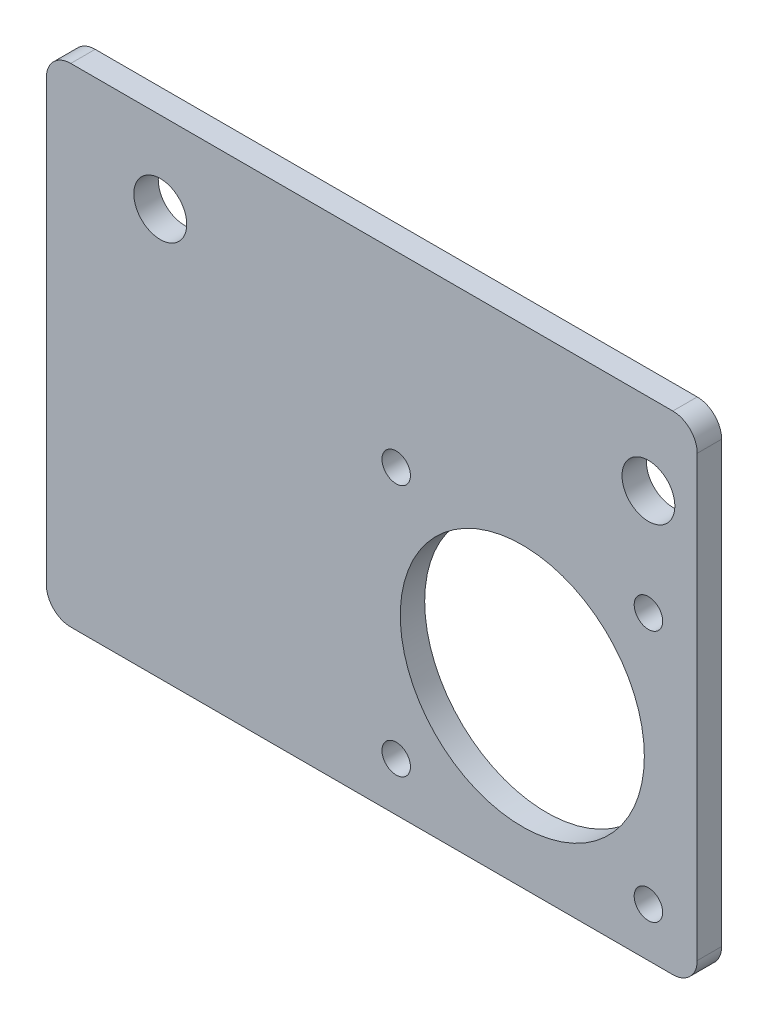
ISO-10303-21;
HEADER;
FILE_DESCRIPTION(('STEP AP214'),'2;1');
FILE_NAME('part.step','',(''),(''),'','','');
FILE_SCHEMA(('AUTOMOTIVE_DESIGN { 1 0 10303 214 1 1 1 1 }'));
ENDSEC;
DATA;
#1=APPLICATION_CONTEXT('core data for automotive mechanical design processes');
#2=APPLICATION_PROTOCOL_DEFINITION('international standard','automotive_design',2000,#1);
#3=PRODUCT_CONTEXT('',#1,'mechanical');
#4=PRODUCT('Part','Part','',(#3));
#5=PRODUCT_RELATED_PRODUCT_CATEGORY('part','',(#4));
#6=PRODUCT_DEFINITION_FORMATION('','',#4);
#7=PRODUCT_DEFINITION_CONTEXT('part definition',#1,'design');
#8=PRODUCT_DEFINITION('design','',#6,#7);
#9=PRODUCT_DEFINITION_SHAPE('','',#8);
#10=(LENGTH_UNIT() NAMED_UNIT(*) SI_UNIT(.MILLI.,.METRE.));
#11=(NAMED_UNIT(*) PLANE_ANGLE_UNIT() SI_UNIT($,.RADIAN.));
#12=(NAMED_UNIT(*) SI_UNIT($,.STERADIAN.) SOLID_ANGLE_UNIT());
#13=UNCERTAINTY_MEASURE_WITH_UNIT(LENGTH_MEASURE(1.E-05),#10,'distance_accuracy_value','');
#14=(GEOMETRIC_REPRESENTATION_CONTEXT(3) GLOBAL_UNCERTAINTY_ASSIGNED_CONTEXT((#13)) GLOBAL_UNIT_ASSIGNED_CONTEXT((#10,
#11,#12)) REPRESENTATION_CONTEXT('',''));
#15=CARTESIAN_POINT('',(0.,0.,0.));
#16=DIRECTION('',(0.,0.,1.));
#17=DIRECTION('',(1.,0.,0.));
#18=AXIS2_PLACEMENT_3D('',#15,#16,#17);
#19=CARTESIAN_POINT('',(-40.,30.,3.));
#20=DIRECTION('',(1.,0.,0.));
#21=DIRECTION('',(0.,1.,0.));
#22=AXIS2_PLACEMENT_3D('',#19,#20,#21);
#23=PLANE('',#22);
#24=DIRECTION('',(0.,-1.,0.));
#25=VECTOR('',#24,1.);
#26=CARTESIAN_POINT('',(-40.,30.,3.));
#27=LINE('',#26,#25);
#28=CARTESIAN_POINT('',(-40.,27.,3.));
#29=VERTEX_POINT('',#28);
#30=CARTESIAN_POINT('',(-40.,-27.,3.));
#31=VERTEX_POINT('',#30);
#32=EDGE_CURVE('E119',#29,#31,#27,.T.);
#33=ORIENTED_EDGE('',*,*,#32,.F.);
#34=DIRECTION('',(0.,0.,-1.));
#35=VECTOR('',#34,1.);
#36=CARTESIAN_POINT('',(-40.,27.,3.));
#37=LINE('',#36,#35);
#38=CARTESIAN_POINT('',(-40.,27.,0.));
#39=VERTEX_POINT('',#38);
#40=EDGE_CURVE('E104',#29,#39,#37,.T.);
#41=ORIENTED_EDGE('',*,*,#40,.T.);
#42=DIRECTION('',(0.,-1.,0.));
#43=VECTOR('',#42,1.);
#44=CARTESIAN_POINT('',(-40.,30.,0.));
#45=LINE('',#44,#43);
#46=CARTESIAN_POINT('',(-40.,-27.,0.));
#47=VERTEX_POINT('',#46);
#48=EDGE_CURVE('E116',#39,#47,#45,.T.);
#49=ORIENTED_EDGE('',*,*,#48,.T.);
#50=DIRECTION('',(0.,0.,-1.));
#51=VECTOR('',#50,1.);
#52=CARTESIAN_POINT('',(-40.,-27.,3.));
#53=LINE('',#52,#51);
#54=EDGE_CURVE('E121',#47,#31,#53,.F.);
#55=ORIENTED_EDGE('',*,*,#54,.T.);
#56=EDGE_LOOP('',(#33,#41,#49,#55));
#57=FACE_BOUND('',#56,.T.);
#58=ADVANCED_FACE('F32',(#57),#23,.F.);
#59=CARTESIAN_POINT('',(40.,-30.,3.));
#60=DIRECTION('',(0.,1.,0.));
#61=DIRECTION('',(-1.,0.,0.));
#62=AXIS2_PLACEMENT_3D('',#59,#60,#61);
#63=PLANE('',#62);
#64=DIRECTION('',(1.,0.,0.));
#65=VECTOR('',#64,1.);
#66=CARTESIAN_POINT('',(40.,-30.,0.));
#67=LINE('',#66,#65);
#68=CARTESIAN_POINT('',(-37.,-30.,0.));
#69=VERTEX_POINT('',#68);
#70=CARTESIAN_POINT('',(37.,-30.,0.));
#71=VERTEX_POINT('',#70);
#72=EDGE_CURVE('E125',#69,#71,#67,.T.);
#73=ORIENTED_EDGE('',*,*,#72,.T.);
#74=DIRECTION('',(0.,0.,-1.));
#75=VECTOR('',#74,1.);
#76=CARTESIAN_POINT('',(37.,-30.,3.));
#77=LINE('',#76,#75);
#78=CARTESIAN_POINT('',(37.,-30.,3.));
#79=VERTEX_POINT('',#78);
#80=EDGE_CURVE('E11',#71,#79,#77,.F.);
#81=ORIENTED_EDGE('',*,*,#80,.T.);
#82=DIRECTION('',(1.,0.,0.));
#83=VECTOR('',#82,1.);
#84=CARTESIAN_POINT('',(40.,-30.,3.));
#85=LINE('',#84,#83);
#86=CARTESIAN_POINT('',(-37.,-30.,3.));
#87=VERTEX_POINT('',#86);
#88=EDGE_CURVE('E201',#87,#79,#85,.T.);
#89=ORIENTED_EDGE('',*,*,#88,.F.);
#90=DIRECTION('',(0.,0.,-1.));
#91=VECTOR('',#90,1.);
#92=CARTESIAN_POINT('',(-37.,-30.,3.));
#93=LINE('',#92,#91);
#94=EDGE_CURVE('E41',#87,#69,#93,.T.);
#95=ORIENTED_EDGE('',*,*,#94,.T.);
#96=EDGE_LOOP('',(#73,#81,#89,#95));
#97=FACE_BOUND('',#96,.T.);
#98=ADVANCED_FACE('F219',(#97),#63,.F.);
#99=CARTESIAN_POINT('',(40.,30.,3.));
#100=DIRECTION('',(-1.,0.,0.));
#101=DIRECTION('',(0.,-1.,0.));
#102=AXIS2_PLACEMENT_3D('',#99,#100,#101);
#103=PLANE('',#102);
#104=DIRECTION('',(0.,1.,0.));
#105=VECTOR('',#104,1.);
#106=CARTESIAN_POINT('',(40.,30.,0.));
#107=LINE('',#106,#105);
#108=CARTESIAN_POINT('',(40.,-27.,0.));
#109=VERTEX_POINT('',#108);
#110=CARTESIAN_POINT('',(40.,27.,0.));
#111=VERTEX_POINT('',#110);
#112=EDGE_CURVE('E129',#109,#111,#107,.T.);
#113=ORIENTED_EDGE('',*,*,#112,.T.);
#114=DIRECTION('',(0.,0.,-1.));
#115=VECTOR('',#114,1.);
#116=CARTESIAN_POINT('',(40.,27.,3.));
#117=LINE('',#116,#115);
#118=CARTESIAN_POINT('',(40.,27.,3.));
#119=VERTEX_POINT('',#118);
#120=EDGE_CURVE('E49',#111,#119,#117,.F.);
#121=ORIENTED_EDGE('',*,*,#120,.T.);
#122=DIRECTION('',(0.,1.,0.));
#123=VECTOR('',#122,1.);
#124=CARTESIAN_POINT('',(40.,30.,3.));
#125=LINE('',#124,#123);
#126=CARTESIAN_POINT('',(40.,-27.,3.));
#127=VERTEX_POINT('',#126);
#128=EDGE_CURVE('E202',#127,#119,#125,.T.);
#129=ORIENTED_EDGE('',*,*,#128,.F.);
#130=DIRECTION('',(0.,0.,-1.));
#131=VECTOR('',#130,1.);
#132=CARTESIAN_POINT('',(40.,-27.,3.));
#133=LINE('',#132,#131);
#134=EDGE_CURVE('E156',#127,#109,#133,.T.);
#135=ORIENTED_EDGE('',*,*,#134,.T.);
#136=EDGE_LOOP('',(#113,#121,#129,#135));
#137=FACE_BOUND('',#136,.T.);
#138=ADVANCED_FACE('F213',(#137),#103,.F.);
#139=CARTESIAN_POINT('',(40.,30.,3.));
#140=DIRECTION('',(0.,-1.,0.));
#141=DIRECTION('',(1.,0.,0.));
#142=AXIS2_PLACEMENT_3D('',#139,#140,#141);
#143=PLANE('',#142);
#144=DIRECTION('',(-1.,0.,0.));
#145=VECTOR('',#144,1.);
#146=CARTESIAN_POINT('',(40.,30.,0.));
#147=LINE('',#146,#145);
#148=CARTESIAN_POINT('',(37.,30.,0.));
#149=VERTEX_POINT('',#148);
#150=CARTESIAN_POINT('',(-37.,30.,0.));
#151=VERTEX_POINT('',#150);
#152=EDGE_CURVE('E139',#149,#151,#147,.T.);
#153=ORIENTED_EDGE('',*,*,#152,.T.);
#154=DIRECTION('',(0.,0.,-1.));
#155=VECTOR('',#154,1.);
#156=CARTESIAN_POINT('',(-37.,30.,3.));
#157=LINE('',#156,#155);
#158=CARTESIAN_POINT('',(-37.,30.,3.));
#159=VERTEX_POINT('',#158);
#160=EDGE_CURVE('E105',#151,#159,#157,.F.);
#161=ORIENTED_EDGE('',*,*,#160,.T.);
#162=DIRECTION('',(-1.,0.,0.));
#163=VECTOR('',#162,1.);
#164=CARTESIAN_POINT('',(40.,30.,3.));
#165=LINE('',#164,#163);
#166=CARTESIAN_POINT('',(37.,30.,3.));
#167=VERTEX_POINT('',#166);
#168=EDGE_CURVE('E135',#167,#159,#165,.T.);
#169=ORIENTED_EDGE('',*,*,#168,.F.);
#170=DIRECTION('',(0.,0.,-1.));
#171=VECTOR('',#170,1.);
#172=CARTESIAN_POINT('',(37.,30.,3.));
#173=LINE('',#172,#171);
#174=EDGE_CURVE('E110',#167,#149,#173,.T.);
#175=ORIENTED_EDGE('',*,*,#174,.T.);
#176=EDGE_LOOP('',(#153,#161,#169,#175));
#177=FACE_BOUND('',#176,.T.);
#178=ADVANCED_FACE('F209',(#177),#143,.F.);
#179=CARTESIAN_POINT('',(-40.,-30.,3.));
#180=DIRECTION('',(0.,0.,-1.));
#181=DIRECTION('',(-1.,0.,0.));
#182=AXIS2_PLACEMENT_3D('',#179,#180,#181);
#183=PLANE('',#182);
#184=CARTESIAN_POINT('',(18.5,-8.5,3.));
#185=DIRECTION('',(0.,0.,1.));
#186=DIRECTION('',(1.,0.,0.));
#187=AXIS2_PLACEMENT_3D('',#184,#185,#186);
#188=CIRCLE('',#187,15.);
#189=CARTESIAN_POINT('',(33.5,-8.5,3.));
#190=VERTEX_POINT('',#189);
#191=EDGE_CURVE('E189',#190,#190,#188,.T.);
#192=ORIENTED_EDGE('',*,*,#191,.F.);
#193=EDGE_LOOP('',(#192));
#194=FACE_BOUND('',#193,.T.);
#195=CARTESIAN_POINT('',(-26.,20.,3.));
#196=DIRECTION('',(0.,0.,1.));
#197=DIRECTION('',(1.,0.,0.));
#198=AXIS2_PLACEMENT_3D('',#195,#196,#197);
#199=CIRCLE('',#198,3.25);
#200=CARTESIAN_POINT('',(-22.75,20.,3.));
#201=VERTEX_POINT('',#200);
#202=EDGE_CURVE('E179',#201,#201,#199,.T.);
#203=ORIENTED_EDGE('',*,*,#202,.F.);
#204=EDGE_LOOP('',(#203));
#205=FACE_BOUND('',#204,.T.);
#206=CARTESIAN_POINT('',(34.,20.,3.));
#207=DIRECTION('',(0.,0.,1.));
#208=DIRECTION('',(1.,0.,0.));
#209=AXIS2_PLACEMENT_3D('',#206,#207,#208);
#210=CIRCLE('',#209,3.25);
#211=CARTESIAN_POINT('',(37.25,20.,3.));
#212=VERTEX_POINT('',#211);
#213=EDGE_CURVE('E176',#212,#212,#210,.T.);
#214=ORIENTED_EDGE('',*,*,#213,.F.);
#215=EDGE_LOOP('',(#214));
#216=FACE_BOUND('',#215,.T.);
#217=CARTESIAN_POINT('',(34.,-24.,3.));
#218=DIRECTION('',(0.,0.,1.));
#219=DIRECTION('',(1.,0.,0.));
#220=AXIS2_PLACEMENT_3D('',#217,#218,#219);
#221=CIRCLE('',#220,1.75);
#222=CARTESIAN_POINT('',(35.75,-24.,3.));
#223=VERTEX_POINT('',#222);
#224=EDGE_CURVE('E173',#223,#223,#221,.T.);
#225=ORIENTED_EDGE('',*,*,#224,.F.);
#226=EDGE_LOOP('',(#225));
#227=FACE_BOUND('',#226,.T.);
#228=CARTESIAN_POINT('',(34.,7.,3.));
#229=DIRECTION('',(0.,0.,1.));
#230=DIRECTION('',(1.,0.,0.));
#231=AXIS2_PLACEMENT_3D('',#228,#229,#230);
#232=CIRCLE('',#231,1.75);
#233=CARTESIAN_POINT('',(35.75,7.,3.));
#234=VERTEX_POINT('',#233);
#235=EDGE_CURVE('E169',#234,#234,#232,.T.);
#236=ORIENTED_EDGE('',*,*,#235,.F.);
#237=EDGE_LOOP('',(#236));
#238=FACE_BOUND('',#237,.T.);
#239=CARTESIAN_POINT('',(3.,7.,3.));
#240=DIRECTION('',(0.,0.,1.));
#241=DIRECTION('',(1.,0.,0.));
#242=AXIS2_PLACEMENT_3D('',#239,#240,#241);
#243=CIRCLE('',#242,1.75);
#244=CARTESIAN_POINT('',(4.75,7.,3.));
#245=VERTEX_POINT('',#244);
#246=EDGE_CURVE('E165',#245,#245,#243,.T.);
#247=ORIENTED_EDGE('',*,*,#246,.F.);
#248=EDGE_LOOP('',(#247));
#249=FACE_BOUND('',#248,.T.);
#250=CARTESIAN_POINT('',(3.00000000000001,-24.,3.));
#251=DIRECTION('',(0.,0.,1.));
#252=DIRECTION('',(1.,0.,0.));
#253=AXIS2_PLACEMENT_3D('',#250,#251,#252);
#254=CIRCLE('',#253,1.75);
#255=CARTESIAN_POINT('',(4.75000000000001,-24.,3.));
#256=VERTEX_POINT('',#255);
#257=EDGE_CURVE('E132',#256,#256,#254,.T.);
#258=ORIENTED_EDGE('',*,*,#257,.F.);
#259=EDGE_LOOP('',(#258));
#260=FACE_BOUND('',#259,.T.);
#261=ORIENTED_EDGE('',*,*,#168,.T.);
#262=CARTESIAN_POINT('',(-37.,27.,3.));
#263=DIRECTION('',(0.,0.,-1.));
#264=DIRECTION('',(-1.,0.,0.));
#265=AXIS2_PLACEMENT_3D('',#262,#263,#264);
#266=CIRCLE('',#265,3.);
#267=EDGE_CURVE('E154',#159,#29,#266,.F.);
#268=ORIENTED_EDGE('',*,*,#267,.T.);
#269=ORIENTED_EDGE('',*,*,#32,.T.);
#270=CARTESIAN_POINT('',(-37.,-27.,3.));
#271=DIRECTION('',(0.,0.,-1.));
#272=DIRECTION('',(-1.,0.,0.));
#273=AXIS2_PLACEMENT_3D('',#270,#271,#272);
#274=CIRCLE('',#273,3.);
#275=EDGE_CURVE('E149',#31,#87,#274,.F.);
#276=ORIENTED_EDGE('',*,*,#275,.T.);
#277=ORIENTED_EDGE('',*,*,#88,.T.);
#278=CARTESIAN_POINT('',(37.,-27.,3.));
#279=DIRECTION('',(0.,0.,-1.));
#280=DIRECTION('',(-1.,0.,0.));
#281=AXIS2_PLACEMENT_3D('',#278,#279,#280);
#282=CIRCLE('',#281,3.);
#283=EDGE_CURVE('E56',#79,#127,#282,.F.);
#284=ORIENTED_EDGE('',*,*,#283,.T.);
#285=ORIENTED_EDGE('',*,*,#128,.T.);
#286=CARTESIAN_POINT('',(37.,27.,3.));
#287=DIRECTION('',(0.,0.,-1.));
#288=DIRECTION('',(-1.,0.,0.));
#289=AXIS2_PLACEMENT_3D('',#286,#287,#288);
#290=CIRCLE('',#289,3.);
#291=EDGE_CURVE('E152',#119,#167,#290,.F.);
#292=ORIENTED_EDGE('',*,*,#291,.T.);
#293=EDGE_LOOP('',(#261,#268,#269,#276,#277,#284,#285,#292));
#294=FACE_BOUND('',#293,.T.);
#295=ADVANCED_FACE('F206',(#194,#205,#216,#227,#238,#249,#260,#294),#183,.F.);
#296=CARTESIAN_POINT('',(-40.,-30.,0.));
#297=DIRECTION('',(0.,0.,-1.));
#298=DIRECTION('',(-1.,0.,0.));
#299=AXIS2_PLACEMENT_3D('',#296,#297,#298);
#300=PLANE('',#299);
#301=CARTESIAN_POINT('',(18.5,-8.5,0.));
#302=DIRECTION('',(0.,0.,-1.));
#303=DIRECTION('',(-1.,0.,0.));
#304=AXIS2_PLACEMENT_3D('',#301,#302,#303);
#305=CIRCLE('',#304,15.);
#306=CARTESIAN_POINT('',(3.50000000000001,-8.5,0.));
#307=VERTEX_POINT('',#306);
#308=EDGE_CURVE('E36',#307,#307,#305,.T.);
#309=ORIENTED_EDGE('',*,*,#308,.F.);
#310=EDGE_LOOP('',(#309));
#311=FACE_BOUND('',#310,.T.);
#312=CARTESIAN_POINT('',(-26.,20.,0.));
#313=DIRECTION('',(0.,0.,-1.));
#314=DIRECTION('',(-1.,0.,0.));
#315=AXIS2_PLACEMENT_3D('',#312,#313,#314);
#316=CIRCLE('',#315,3.25);
#317=CARTESIAN_POINT('',(-29.25,20.,0.));
#318=VERTEX_POINT('',#317);
#319=EDGE_CURVE('E177',#318,#318,#316,.T.);
#320=ORIENTED_EDGE('',*,*,#319,.F.);
#321=EDGE_LOOP('',(#320));
#322=FACE_BOUND('',#321,.T.);
#323=CARTESIAN_POINT('',(34.,20.,0.));
#324=DIRECTION('',(0.,0.,-1.));
#325=DIRECTION('',(-1.,0.,0.));
#326=AXIS2_PLACEMENT_3D('',#323,#324,#325);
#327=CIRCLE('',#326,3.25);
#328=CARTESIAN_POINT('',(30.75,20.,0.));
#329=VERTEX_POINT('',#328);
#330=EDGE_CURVE('E174',#329,#329,#327,.T.);
#331=ORIENTED_EDGE('',*,*,#330,.F.);
#332=EDGE_LOOP('',(#331));
#333=FACE_BOUND('',#332,.T.);
#334=CARTESIAN_POINT('',(34.,-24.,0.));
#335=DIRECTION('',(0.,0.,-1.));
#336=DIRECTION('',(-1.,0.,0.));
#337=AXIS2_PLACEMENT_3D('',#334,#335,#336);
#338=CIRCLE('',#337,1.75);
#339=CARTESIAN_POINT('',(32.25,-24.,0.));
#340=VERTEX_POINT('',#339);
#341=EDGE_CURVE('E170',#340,#340,#338,.T.);
#342=ORIENTED_EDGE('',*,*,#341,.F.);
#343=EDGE_LOOP('',(#342));
#344=FACE_BOUND('',#343,.T.);
#345=CARTESIAN_POINT('',(34.,7.,0.));
#346=DIRECTION('',(0.,0.,-1.));
#347=DIRECTION('',(-1.,0.,0.));
#348=AXIS2_PLACEMENT_3D('',#345,#346,#347);
#349=CIRCLE('',#348,1.75);
#350=CARTESIAN_POINT('',(32.25,7.,0.));
#351=VERTEX_POINT('',#350);
#352=EDGE_CURVE('E166',#351,#351,#349,.T.);
#353=ORIENTED_EDGE('',*,*,#352,.F.);
#354=EDGE_LOOP('',(#353));
#355=FACE_BOUND('',#354,.T.);
#356=CARTESIAN_POINT('',(3.,7.,0.));
#357=DIRECTION('',(0.,0.,-1.));
#358=DIRECTION('',(-1.,0.,0.));
#359=AXIS2_PLACEMENT_3D('',#356,#357,#358);
#360=CIRCLE('',#359,1.75);
#361=CARTESIAN_POINT('',(1.25,7.,0.));
#362=VERTEX_POINT('',#361);
#363=EDGE_CURVE('E162',#362,#362,#360,.T.);
#364=ORIENTED_EDGE('',*,*,#363,.F.);
#365=EDGE_LOOP('',(#364));
#366=FACE_BOUND('',#365,.T.);
#367=CARTESIAN_POINT('',(3.00000000000001,-24.,0.));
#368=DIRECTION('',(0.,0.,-1.));
#369=DIRECTION('',(-1.,0.,0.));
#370=AXIS2_PLACEMENT_3D('',#367,#368,#369);
#371=CIRCLE('',#370,1.75);
#372=CARTESIAN_POINT('',(1.25,-24.,0.));
#373=VERTEX_POINT('',#372);
#374=EDGE_CURVE('E126',#373,#373,#371,.T.);
#375=ORIENTED_EDGE('',*,*,#374,.F.);
#376=EDGE_LOOP('',(#375));
#377=FACE_BOUND('',#376,.T.);
#378=ORIENTED_EDGE('',*,*,#48,.F.);
#379=CARTESIAN_POINT('',(-37.,27.,0.));
#380=DIRECTION('',(0.,0.,-1.));
#381=DIRECTION('',(-1.,0.,0.));
#382=AXIS2_PLACEMENT_3D('',#379,#380,#381);
#383=CIRCLE('',#382,3.);
#384=EDGE_CURVE('E100',#39,#151,#383,.T.);
#385=ORIENTED_EDGE('',*,*,#384,.T.);
#386=ORIENTED_EDGE('',*,*,#152,.F.);
#387=CARTESIAN_POINT('',(37.,27.,0.));
#388=DIRECTION('',(0.,0.,-1.));
#389=DIRECTION('',(-1.,0.,0.));
#390=AXIS2_PLACEMENT_3D('',#387,#388,#389);
#391=CIRCLE('',#390,3.);
#392=EDGE_CURVE('E111',#149,#111,#391,.T.);
#393=ORIENTED_EDGE('',*,*,#392,.T.);
#394=ORIENTED_EDGE('',*,*,#112,.F.);
#395=CARTESIAN_POINT('',(37.,-27.,0.));
#396=DIRECTION('',(0.,0.,-1.));
#397=DIRECTION('',(-1.,0.,0.));
#398=AXIS2_PLACEMENT_3D('',#395,#396,#397);
#399=CIRCLE('',#398,3.);
#400=EDGE_CURVE('E143',#109,#71,#399,.T.);
#401=ORIENTED_EDGE('',*,*,#400,.T.);
#402=ORIENTED_EDGE('',*,*,#72,.F.);
#403=CARTESIAN_POINT('',(-37.,-27.,0.));
#404=DIRECTION('',(0.,0.,-1.));
#405=DIRECTION('',(-1.,0.,0.));
#406=AXIS2_PLACEMENT_3D('',#403,#404,#405);
#407=CIRCLE('',#406,3.);
#408=EDGE_CURVE('E120',#69,#47,#407,.T.);
#409=ORIENTED_EDGE('',*,*,#408,.T.);
#410=EDGE_LOOP('',(#378,#385,#386,#393,#394,#401,#402,#409));
#411=FACE_BOUND('',#410,.T.);
#412=ADVANCED_FACE('F123',(#311,#322,#333,#344,#355,#366,#377,#411),#300,.T.);
#413=CARTESIAN_POINT('',(-37.,27.,3.));
#414=DIRECTION('',(0.,0.,-1.));
#415=DIRECTION('',(-1.,0.,0.));
#416=AXIS2_PLACEMENT_3D('',#413,#414,#415);
#417=CYLINDRICAL_SURFACE('',#416,3.);
#418=ORIENTED_EDGE('',*,*,#267,.F.);
#419=ORIENTED_EDGE('',*,*,#160,.F.);
#420=ORIENTED_EDGE('',*,*,#384,.F.);
#421=ORIENTED_EDGE('',*,*,#40,.F.);
#422=EDGE_LOOP('',(#418,#419,#420,#421));
#423=FACE_BOUND('',#422,.T.);
#424=ADVANCED_FACE('F103',(#423),#417,.T.);
#425=CARTESIAN_POINT('',(37.,27.,3.));
#426=DIRECTION('',(0.,0.,-1.));
#427=DIRECTION('',(-1.,0.,0.));
#428=AXIS2_PLACEMENT_3D('',#425,#426,#427);
#429=CYLINDRICAL_SURFACE('',#428,3.);
#430=ORIENTED_EDGE('',*,*,#291,.F.);
#431=ORIENTED_EDGE('',*,*,#120,.F.);
#432=ORIENTED_EDGE('',*,*,#392,.F.);
#433=ORIENTED_EDGE('',*,*,#174,.F.);
#434=EDGE_LOOP('',(#430,#431,#432,#433));
#435=FACE_BOUND('',#434,.T.);
#436=ADVANCED_FACE('F211',(#435),#429,.T.);
#437=CARTESIAN_POINT('',(37.,-27.,3.));
#438=DIRECTION('',(0.,0.,-1.));
#439=DIRECTION('',(-1.,0.,0.));
#440=AXIS2_PLACEMENT_3D('',#437,#438,#439);
#441=CYLINDRICAL_SURFACE('',#440,3.);
#442=ORIENTED_EDGE('',*,*,#283,.F.);
#443=ORIENTED_EDGE('',*,*,#80,.F.);
#444=ORIENTED_EDGE('',*,*,#400,.F.);
#445=ORIENTED_EDGE('',*,*,#134,.F.);
#446=EDGE_LOOP('',(#442,#443,#444,#445));
#447=FACE_BOUND('',#446,.T.);
#448=ADVANCED_FACE('F216',(#447),#441,.T.);
#449=CARTESIAN_POINT('',(-37.,-27.,3.));
#450=DIRECTION('',(0.,0.,-1.));
#451=DIRECTION('',(-1.,0.,0.));
#452=AXIS2_PLACEMENT_3D('',#449,#450,#451);
#453=CYLINDRICAL_SURFACE('',#452,3.);
#454=ORIENTED_EDGE('',*,*,#275,.F.);
#455=ORIENTED_EDGE('',*,*,#54,.F.);
#456=ORIENTED_EDGE('',*,*,#408,.F.);
#457=ORIENTED_EDGE('',*,*,#94,.F.);
#458=EDGE_LOOP('',(#454,#455,#456,#457));
#459=FACE_BOUND('',#458,.T.);
#460=ADVANCED_FACE('F34',(#459),#453,.T.);
#461=CARTESIAN_POINT('',(3.00000000000001,-24.,-9.));
#462=DIRECTION('',(0.,0.,1.));
#463=DIRECTION('',(1.,0.,0.));
#464=AXIS2_PLACEMENT_3D('',#461,#462,#463);
#465=CYLINDRICAL_SURFACE('',#464,1.75);
#466=ORIENTED_EDGE('',*,*,#374,.T.);
#467=EDGE_LOOP('',(#466));
#468=FACE_BOUND('',#467,.T.);
#469=ORIENTED_EDGE('',*,*,#257,.T.);
#470=EDGE_LOOP('',(#469));
#471=FACE_BOUND('',#470,.T.);
#472=ADVANCED_FACE('F225',(#468,#471),#465,.F.);
#473=CARTESIAN_POINT('',(3.,7.,-9.));
#474=DIRECTION('',(0.,0.,1.));
#475=DIRECTION('',(1.,0.,0.));
#476=AXIS2_PLACEMENT_3D('',#473,#474,#475);
#477=CYLINDRICAL_SURFACE('',#476,1.75);
#478=ORIENTED_EDGE('',*,*,#363,.T.);
#479=EDGE_LOOP('',(#478));
#480=FACE_BOUND('',#479,.T.);
#481=ORIENTED_EDGE('',*,*,#246,.T.);
#482=EDGE_LOOP('',(#481));
#483=FACE_BOUND('',#482,.T.);
#484=ADVANCED_FACE('F230',(#480,#483),#477,.F.);
#485=CARTESIAN_POINT('',(34.,7.,-9.));
#486=DIRECTION('',(0.,0.,1.));
#487=DIRECTION('',(1.,0.,0.));
#488=AXIS2_PLACEMENT_3D('',#485,#486,#487);
#489=CYLINDRICAL_SURFACE('',#488,1.75);
#490=ORIENTED_EDGE('',*,*,#352,.T.);
#491=EDGE_LOOP('',(#490));
#492=FACE_BOUND('',#491,.T.);
#493=ORIENTED_EDGE('',*,*,#235,.T.);
#494=EDGE_LOOP('',(#493));
#495=FACE_BOUND('',#494,.T.);
#496=ADVANCED_FACE('F292',(#492,#495),#489,.F.);
#497=CARTESIAN_POINT('',(34.,-24.,-9.));
#498=DIRECTION('',(0.,0.,1.));
#499=DIRECTION('',(1.,0.,0.));
#500=AXIS2_PLACEMENT_3D('',#497,#498,#499);
#501=CYLINDRICAL_SURFACE('',#500,1.75);
#502=ORIENTED_EDGE('',*,*,#341,.T.);
#503=EDGE_LOOP('',(#502));
#504=FACE_BOUND('',#503,.T.);
#505=ORIENTED_EDGE('',*,*,#224,.T.);
#506=EDGE_LOOP('',(#505));
#507=FACE_BOUND('',#506,.T.);
#508=ADVANCED_FACE('F302',(#504,#507),#501,.F.);
#509=CARTESIAN_POINT('',(34.,20.,-9.));
#510=DIRECTION('',(0.,0.,1.));
#511=DIRECTION('',(1.,0.,0.));
#512=AXIS2_PLACEMENT_3D('',#509,#510,#511);
#513=CYLINDRICAL_SURFACE('',#512,3.25);
#514=ORIENTED_EDGE('',*,*,#330,.T.);
#515=EDGE_LOOP('',(#514));
#516=FACE_BOUND('',#515,.T.);
#517=ORIENTED_EDGE('',*,*,#213,.T.);
#518=EDGE_LOOP('',(#517));
#519=FACE_BOUND('',#518,.T.);
#520=ADVANCED_FACE('F312',(#516,#519),#513,.F.);
#521=CARTESIAN_POINT('',(-26.,20.,-9.));
#522=DIRECTION('',(0.,0.,1.));
#523=DIRECTION('',(1.,0.,0.));
#524=AXIS2_PLACEMENT_3D('',#521,#522,#523);
#525=CYLINDRICAL_SURFACE('',#524,3.25);
#526=ORIENTED_EDGE('',*,*,#319,.T.);
#527=EDGE_LOOP('',(#526));
#528=FACE_BOUND('',#527,.T.);
#529=ORIENTED_EDGE('',*,*,#202,.T.);
#530=EDGE_LOOP('',(#529));
#531=FACE_BOUND('',#530,.T.);
#532=ADVANCED_FACE('F322',(#528,#531),#525,.F.);
#533=CARTESIAN_POINT('',(18.5,-8.5,-9.));
#534=DIRECTION('',(0.,0.,1.));
#535=DIRECTION('',(1.,0.,0.));
#536=AXIS2_PLACEMENT_3D('',#533,#534,#535);
#537=CYLINDRICAL_SURFACE('',#536,15.);
#538=ORIENTED_EDGE('',*,*,#308,.T.);
#539=EDGE_LOOP('',(#538));
#540=FACE_BOUND('',#539,.T.);
#541=ORIENTED_EDGE('',*,*,#191,.T.);
#542=EDGE_LOOP('',(#541));
#543=FACE_BOUND('',#542,.T.);
#544=ADVANCED_FACE('F332',(#540,#543),#537,.F.);
#545=CLOSED_SHELL('',(#58,#98,#138,#178,#295,#412,#424,#436,#448,#460,#472,#484,#496,#508,#520,
#532,#544));
#546=MANIFOLD_SOLID_BREP('B2',#545);
#547=ADVANCED_BREP_SHAPE_REPRESENTATION('',(#18,#546),#14);
#548=SHAPE_DEFINITION_REPRESENTATION(#9,#547);
ENDSEC;
END-ISO-10303-21;
